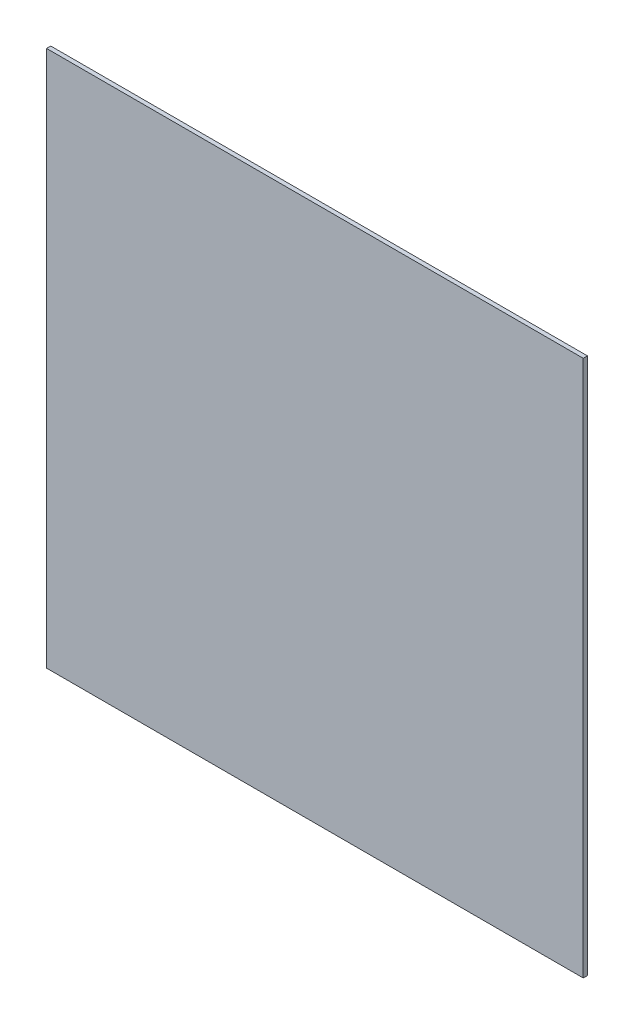
ISO-10303-21;
HEADER;
FILE_DESCRIPTION(('STEP AP214'),'2;1');
FILE_NAME('part.step','',(''),(''),'','','');
FILE_SCHEMA(('AUTOMOTIVE_DESIGN { 1 0 10303 214 1 1 1 1 }'));
ENDSEC;
DATA;
#1=APPLICATION_CONTEXT('core data for automotive mechanical design processes');
#2=APPLICATION_PROTOCOL_DEFINITION('international standard','automotive_design',2000,#1);
#3=PRODUCT_CONTEXT('',#1,'mechanical');
#4=PRODUCT('Part','Part','',(#3));
#5=PRODUCT_RELATED_PRODUCT_CATEGORY('part','',(#4));
#6=PRODUCT_DEFINITION_FORMATION('','',#4);
#7=PRODUCT_DEFINITION_CONTEXT('part definition',#1,'design');
#8=PRODUCT_DEFINITION('design','',#6,#7);
#9=PRODUCT_DEFINITION_SHAPE('','',#8);
#10=(LENGTH_UNIT() NAMED_UNIT(*) SI_UNIT(.MILLI.,.METRE.));
#11=(NAMED_UNIT(*) PLANE_ANGLE_UNIT() SI_UNIT($,.RADIAN.));
#12=(NAMED_UNIT(*) SI_UNIT($,.STERADIAN.) SOLID_ANGLE_UNIT());
#13=UNCERTAINTY_MEASURE_WITH_UNIT(LENGTH_MEASURE(1.E-05),#10,'distance_accuracy_value','');
#14=(GEOMETRIC_REPRESENTATION_CONTEXT(3) GLOBAL_UNCERTAINTY_ASSIGNED_CONTEXT((#13)) GLOBAL_UNIT_ASSIGNED_CONTEXT((#10,
#11,#12)) REPRESENTATION_CONTEXT('',''));
#15=CARTESIAN_POINT('',(0.,0.,0.));
#16=DIRECTION('',(0.,0.,1.));
#17=DIRECTION('',(1.,0.,0.));
#18=AXIS2_PLACEMENT_3D('',#15,#16,#17);
#19=CARTESIAN_POINT('',(-304.8,-304.8,4.7625));
#20=DIRECTION('',(0.,1.,0.));
#21=DIRECTION('',(0.,0.,1.));
#22=AXIS2_PLACEMENT_3D('',#19,#20,#21);
#23=PLANE('',#22);
#24=DIRECTION('',(1.,0.,0.));
#25=VECTOR('',#24,1.);
#26=CARTESIAN_POINT('',(-304.8,-304.8,0.));
#27=LINE('',#26,#25);
#28=CARTESIAN_POINT('',(-304.8,-304.8,0.));
#29=VERTEX_POINT('',#28);
#30=CARTESIAN_POINT('',(304.8,-304.8,0.));
#31=VERTEX_POINT('',#30);
#32=EDGE_CURVE('E96',#29,#31,#27,.T.);
#33=ORIENTED_EDGE('',*,*,#32,.T.);
#34=DIRECTION('',(0.,0.,-1.));
#35=VECTOR('',#34,1.);
#36=CARTESIAN_POINT('',(304.8,-304.8,4.7625));
#37=LINE('',#36,#35);
#38=CARTESIAN_POINT('',(304.8,-304.8,4.7625));
#39=VERTEX_POINT('',#38);
#40=EDGE_CURVE('E11',#39,#31,#37,.T.);
#41=ORIENTED_EDGE('',*,*,#40,.F.);
#42=DIRECTION('',(1.,0.,0.));
#43=VECTOR('',#42,1.);
#44=CARTESIAN_POINT('',(-304.8,-304.8,4.7625));
#45=LINE('',#44,#43);
#46=CARTESIAN_POINT('',(-304.8,-304.8,4.7625));
#47=VERTEX_POINT('',#46);
#48=EDGE_CURVE('E82',#47,#39,#45,.T.);
#49=ORIENTED_EDGE('',*,*,#48,.F.);
#50=DIRECTION('',(0.,0.,-1.));
#51=VECTOR('',#50,1.);
#52=CARTESIAN_POINT('',(-304.8,-304.8,4.7625));
#53=LINE('',#52,#51);
#54=EDGE_CURVE('E49',#47,#29,#53,.T.);
#55=ORIENTED_EDGE('',*,*,#54,.T.);
#56=EDGE_LOOP('',(#33,#41,#49,#55));
#57=FACE_BOUND('',#56,.T.);
#58=ADVANCED_FACE('F33',(#57),#23,.F.);
#59=CARTESIAN_POINT('',(304.8,-304.8,4.7625));
#60=DIRECTION('',(-1.,0.,0.));
#61=DIRECTION('',(0.,0.,1.));
#62=AXIS2_PLACEMENT_3D('',#59,#60,#61);
#63=PLANE('',#62);
#64=DIRECTION('',(0.,1.,0.));
#65=VECTOR('',#64,1.);
#66=CARTESIAN_POINT('',(304.8,-304.8,0.));
#67=LINE('',#66,#65);
#68=CARTESIAN_POINT('',(304.8,304.8,0.));
#69=VERTEX_POINT('',#68);
#70=EDGE_CURVE('E87',#31,#69,#67,.T.);
#71=ORIENTED_EDGE('',*,*,#70,.T.);
#72=DIRECTION('',(0.,0.,-1.));
#73=VECTOR('',#72,1.);
#74=CARTESIAN_POINT('',(304.8,304.8,4.7625));
#75=LINE('',#74,#73);
#76=CARTESIAN_POINT('',(304.8,304.8,4.7625));
#77=VERTEX_POINT('',#76);
#78=EDGE_CURVE('E41',#77,#69,#75,.T.);
#79=ORIENTED_EDGE('',*,*,#78,.F.);
#80=DIRECTION('',(0.,1.,0.));
#81=VECTOR('',#80,1.);
#82=CARTESIAN_POINT('',(304.8,-304.8,4.7625));
#83=LINE('',#82,#81);
#84=EDGE_CURVE('E74',#39,#77,#83,.T.);
#85=ORIENTED_EDGE('',*,*,#84,.F.);
#86=ORIENTED_EDGE('',*,*,#40,.T.);
#87=EDGE_LOOP('',(#71,#79,#85,#86));
#88=FACE_BOUND('',#87,.T.);
#89=ADVANCED_FACE('F86',(#88),#63,.F.);
#90=CARTESIAN_POINT('',(-304.8,304.8,4.7625));
#91=DIRECTION('',(0.,1.,0.));
#92=DIRECTION('',(0.,0.,1.));
#93=AXIS2_PLACEMENT_3D('',#90,#91,#92);
#94=PLANE('',#93);
#95=DIRECTION('',(1.,0.,0.));
#96=VECTOR('',#95,1.);
#97=CARTESIAN_POINT('',(-304.8,304.8,0.));
#98=LINE('',#97,#96);
#99=CARTESIAN_POINT('',(-304.8,304.8,0.));
#100=VERTEX_POINT('',#99);
#101=EDGE_CURVE('E99',#100,#69,#98,.T.);
#102=ORIENTED_EDGE('',*,*,#101,.F.);
#103=DIRECTION('',(0.,0.,-1.));
#104=VECTOR('',#103,1.);
#105=CARTESIAN_POINT('',(-304.8,304.8,4.7625));
#106=LINE('',#105,#104);
#107=CARTESIAN_POINT('',(-304.8,304.8,4.7625));
#108=VERTEX_POINT('',#107);
#109=EDGE_CURVE('E63',#108,#100,#106,.T.);
#110=ORIENTED_EDGE('',*,*,#109,.F.);
#111=DIRECTION('',(1.,0.,0.));
#112=VECTOR('',#111,1.);
#113=CARTESIAN_POINT('',(-304.8,304.8,4.7625));
#114=LINE('',#113,#112);
#115=EDGE_CURVE('E81',#108,#77,#114,.T.);
#116=ORIENTED_EDGE('',*,*,#115,.T.);
#117=ORIENTED_EDGE('',*,*,#78,.T.);
#118=EDGE_LOOP('',(#102,#110,#116,#117));
#119=FACE_BOUND('',#118,.T.);
#120=ADVANCED_FACE('F90',(#119),#94,.T.);
#121=CARTESIAN_POINT('',(-304.8,-304.8,4.7625));
#122=DIRECTION('',(-1.,0.,0.));
#123=DIRECTION('',(0.,0.,1.));
#124=AXIS2_PLACEMENT_3D('',#121,#122,#123);
#125=PLANE('',#124);
#126=DIRECTION('',(0.,1.,0.));
#127=VECTOR('',#126,1.);
#128=CARTESIAN_POINT('',(-304.8,-304.8,0.));
#129=LINE('',#128,#127);
#130=EDGE_CURVE('E101',#29,#100,#129,.T.);
#131=ORIENTED_EDGE('',*,*,#130,.F.);
#132=ORIENTED_EDGE('',*,*,#54,.F.);
#133=DIRECTION('',(0.,1.,0.));
#134=VECTOR('',#133,1.);
#135=CARTESIAN_POINT('',(-304.8,-304.8,4.7625));
#136=LINE('',#135,#134);
#137=EDGE_CURVE('E91',#47,#108,#136,.T.);
#138=ORIENTED_EDGE('',*,*,#137,.T.);
#139=ORIENTED_EDGE('',*,*,#109,.T.);
#140=EDGE_LOOP('',(#131,#132,#138,#139));
#141=FACE_BOUND('',#140,.T.);
#142=ADVANCED_FACE('F107',(#141),#125,.T.);
#143=CARTESIAN_POINT('',(0.,0.,4.7625));
#144=DIRECTION('',(0.,0.,1.));
#145=DIRECTION('',(1.,0.,0.));
#146=AXIS2_PLACEMENT_3D('',#143,#144,#145);
#147=PLANE('',#146);
#148=ORIENTED_EDGE('',*,*,#48,.T.);
#149=ORIENTED_EDGE('',*,*,#84,.T.);
#150=ORIENTED_EDGE('',*,*,#115,.F.);
#151=ORIENTED_EDGE('',*,*,#137,.F.);
#152=EDGE_LOOP('',(#148,#149,#150,#151));
#153=FACE_BOUND('',#152,.T.);
#154=ADVANCED_FACE('F78',(#153),#147,.T.);
#155=CARTESIAN_POINT('',(0.,0.,0.));
#156=DIRECTION('',(0.,0.,1.));
#157=DIRECTION('',(1.,0.,0.));
#158=AXIS2_PLACEMENT_3D('',#155,#156,#157);
#159=PLANE('',#158);
#160=ORIENTED_EDGE('',*,*,#32,.F.);
#161=ORIENTED_EDGE('',*,*,#130,.T.);
#162=ORIENTED_EDGE('',*,*,#101,.T.);
#163=ORIENTED_EDGE('',*,*,#70,.F.);
#164=EDGE_LOOP('',(#160,#161,#162,#163));
#165=FACE_BOUND('',#164,.T.);
#166=ADVANCED_FACE('F106',(#165),#159,.F.);
#167=CLOSED_SHELL('',(#58,#89,#120,#142,#154,#166));
#168=MANIFOLD_SOLID_BREP('B2',#167);
#169=ADVANCED_BREP_SHAPE_REPRESENTATION('',(#18,#168),#14);
#170=SHAPE_DEFINITION_REPRESENTATION(#9,#169);
ENDSEC;
END-ISO-10303-21;
